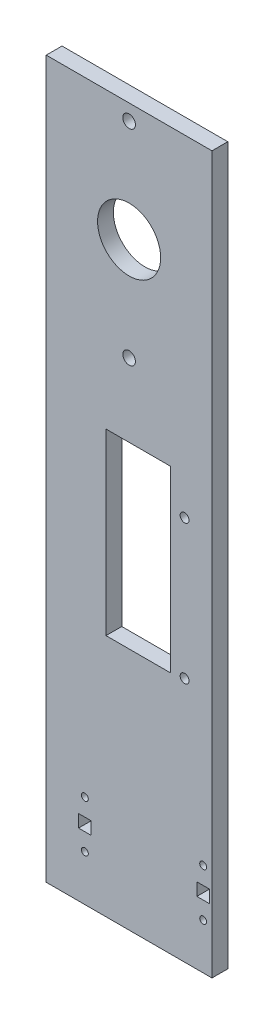
ISO-10303-21;
HEADER;
FILE_DESCRIPTION(('STEP AP214'),'2;1');
FILE_NAME('part.step','',(''),(''),'','','');
FILE_SCHEMA(('AUTOMOTIVE_DESIGN { 1 0 10303 214 1 1 1 1 }'));
ENDSEC;
DATA;
#1=APPLICATION_CONTEXT('core data for automotive mechanical design processes');
#2=APPLICATION_PROTOCOL_DEFINITION('international standard','automotive_design',2000,#1);
#3=PRODUCT_CONTEXT('',#1,'mechanical');
#4=PRODUCT('Part','Part','',(#3));
#5=PRODUCT_RELATED_PRODUCT_CATEGORY('part','',(#4));
#6=PRODUCT_DEFINITION_FORMATION('','',#4);
#7=PRODUCT_DEFINITION_CONTEXT('part definition',#1,'design');
#8=PRODUCT_DEFINITION('design','',#6,#7);
#9=PRODUCT_DEFINITION_SHAPE('','',#8);
#10=(LENGTH_UNIT() NAMED_UNIT(*) SI_UNIT(.MILLI.,.METRE.));
#11=(NAMED_UNIT(*) PLANE_ANGLE_UNIT() SI_UNIT($,.RADIAN.));
#12=(NAMED_UNIT(*) SI_UNIT($,.STERADIAN.) SOLID_ANGLE_UNIT());
#13=UNCERTAINTY_MEASURE_WITH_UNIT(LENGTH_MEASURE(1.E-05),#10,'distance_accuracy_value','');
#14=(GEOMETRIC_REPRESENTATION_CONTEXT(3) GLOBAL_UNCERTAINTY_ASSIGNED_CONTEXT((#13)) GLOBAL_UNIT_ASSIGNED_CONTEXT((#10,
#11,#12)) REPRESENTATION_CONTEXT('',''));
#15=CARTESIAN_POINT('',(0.,0.,0.));
#16=DIRECTION('',(0.,0.,1.));
#17=DIRECTION('',(1.,0.,0.));
#18=AXIS2_PLACEMENT_3D('',#15,#16,#17);
#19=CARTESIAN_POINT('',(0.,0.,6.35));
#20=DIRECTION('',(0.,0.,1.));
#21=DIRECTION('',(1.,0.,0.));
#22=AXIS2_PLACEMENT_3D('',#19,#20,#21);
#23=PLANE('',#22);
#24=DIRECTION('',(0.,-1.,0.));
#25=VECTOR('',#24,1.);
#26=CARTESIAN_POINT('',(24.05,-118.29,6.35));
#27=LINE('',#26,#25);
#28=CARTESIAN_POINT('',(24.05,-118.29,6.35));
#29=VERTEX_POINT('',#28);
#30=CARTESIAN_POINT('',(24.05,-190.29,6.35));
#31=VERTEX_POINT('',#30);
#32=EDGE_CURVE('E162',#29,#31,#27,.T.);
#33=ORIENTED_EDGE('',*,*,#32,.F.);
#34=DIRECTION('',(-1.,0.,0.));
#35=VECTOR('',#34,1.);
#36=CARTESIAN_POINT('',(50.05,-118.29,6.35));
#37=LINE('',#36,#35);
#38=CARTESIAN_POINT('',(50.05,-118.29,6.35));
#39=VERTEX_POINT('',#38);
#40=EDGE_CURVE('E153',#39,#29,#37,.T.);
#41=ORIENTED_EDGE('',*,*,#40,.F.);
#42=DIRECTION('',(0.,1.,0.));
#43=VECTOR('',#42,1.);
#44=CARTESIAN_POINT('',(50.05,-190.29,6.35));
#45=LINE('',#44,#43);
#46=CARTESIAN_POINT('',(50.05,-190.29,6.35));
#47=VERTEX_POINT('',#46);
#48=EDGE_CURVE('E180',#47,#39,#45,.T.);
#49=ORIENTED_EDGE('',*,*,#48,.F.);
#50=DIRECTION('',(1.,0.,0.));
#51=VECTOR('',#50,1.);
#52=CARTESIAN_POINT('',(24.05,-190.29,6.35));
#53=LINE('',#52,#51);
#54=EDGE_CURVE('E176',#31,#47,#53,.T.);
#55=ORIENTED_EDGE('',*,*,#54,.F.);
#56=EDGE_LOOP('',(#33,#41,#49,#55));
#57=FACE_BOUND('',#56,.T.);
#58=CARTESIAN_POINT('',(33.35,-47.6,6.35));
#59=DIRECTION('',(0.,0.,1.));
#60=DIRECTION('',(1.,0.,0.));
#61=AXIS2_PLACEMENT_3D('',#58,#59,#60);
#62=CIRCLE('',#61,12.7);
#63=CARTESIAN_POINT('',(46.05,-47.6,6.35));
#64=VERTEX_POINT('',#63);
#65=EDGE_CURVE('E204',#64,#64,#62,.T.);
#66=ORIENTED_EDGE('',*,*,#65,.F.);
#67=EDGE_LOOP('',(#66));
#68=FACE_BOUND('',#67,.T.);
#69=CARTESIAN_POINT('',(55.675,-189.39,6.35));
#70=DIRECTION('',(0.,0.,1.));
#71=DIRECTION('',(1.,0.,0.));
#72=AXIS2_PLACEMENT_3D('',#69,#70,#71);
#73=CIRCLE('',#72,1.7859375);
#74=CARTESIAN_POINT('',(57.4609375,-189.39,6.35));
#75=VERTEX_POINT('',#74);
#76=EDGE_CURVE('E220',#75,#75,#73,.T.);
#77=ORIENTED_EDGE('',*,*,#76,.F.);
#78=EDGE_LOOP('',(#77));
#79=FACE_BOUND('',#78,.T.);
#80=DIRECTION('',(0.,1.,0.));
#81=VECTOR('',#80,1.);
#82=CARTESIAN_POINT('',(18.08,-262.89,6.35));
#83=LINE('',#82,#81);
#84=CARTESIAN_POINT('',(18.08,-262.89,6.35));
#85=VERTEX_POINT('',#84);
#86=CARTESIAN_POINT('',(18.08,-257.81,6.35));
#87=VERTEX_POINT('',#86);
#88=EDGE_CURVE('E239',#85,#87,#83,.T.);
#89=ORIENTED_EDGE('',*,*,#88,.F.);
#90=DIRECTION('',(1.,0.,0.));
#91=VECTOR('',#90,1.);
#92=CARTESIAN_POINT('',(13.,-262.89,6.35));
#93=LINE('',#92,#91);
#94=CARTESIAN_POINT('',(13.,-262.89,6.35));
#95=VERTEX_POINT('',#94);
#96=EDGE_CURVE('E236',#95,#85,#93,.T.);
#97=ORIENTED_EDGE('',*,*,#96,.F.);
#98=DIRECTION('',(0.,-1.,0.));
#99=VECTOR('',#98,1.);
#100=CARTESIAN_POINT('',(13.,-262.89,6.35));
#101=LINE('',#100,#99);
#102=CARTESIAN_POINT('',(13.,-257.81,6.35));
#103=VERTEX_POINT('',#102);
#104=EDGE_CURVE('E247',#103,#95,#101,.T.);
#105=ORIENTED_EDGE('',*,*,#104,.F.);
#106=DIRECTION('',(-1.,0.,0.));
#107=VECTOR('',#106,1.);
#108=CARTESIAN_POINT('',(13.,-257.81,6.35));
#109=LINE('',#108,#107);
#110=EDGE_CURVE('E243',#87,#103,#109,.T.);
#111=ORIENTED_EDGE('',*,*,#110,.F.);
#112=EDGE_LOOP('',(#89,#97,#105,#111));
#113=FACE_BOUND('',#112,.T.);
#114=CARTESIAN_POINT('',(15.54,-269.875,6.35));
#115=DIRECTION('',(0.,0.,1.));
#116=DIRECTION('',(1.,0.,0.));
#117=AXIS2_PLACEMENT_3D('',#114,#115,#116);
#118=CIRCLE('',#117,1.38906249999998);
#119=CARTESIAN_POINT('',(16.9290625,-269.875,6.35));
#120=VERTEX_POINT('',#119);
#121=EDGE_CURVE('E279',#120,#120,#118,.T.);
#122=ORIENTED_EDGE('',*,*,#121,.F.);
#123=EDGE_LOOP('',(#122));
#124=FACE_BOUND('',#123,.T.);
#125=CARTESIAN_POINT('',(63.16,-250.825,6.35));
#126=DIRECTION('',(0.,0.,1.));
#127=DIRECTION('',(1.,0.,0.));
#128=AXIS2_PLACEMENT_3D('',#125,#126,#127);
#129=CIRCLE('',#128,1.38906249999997);
#130=CARTESIAN_POINT('',(64.5490625,-250.825,6.35));
#131=VERTEX_POINT('',#130);
#132=EDGE_CURVE('E295',#131,#131,#129,.T.);
#133=ORIENTED_EDGE('',*,*,#132,.F.);
#134=EDGE_LOOP('',(#133));
#135=FACE_BOUND('',#134,.T.);
#136=DIRECTION('',(1.,0.,0.));
#137=VECTOR('',#136,1.);
#138=CARTESIAN_POINT('',(60.62,-262.89,6.35));
#139=LINE('',#138,#137);
#140=CARTESIAN_POINT('',(60.62,-262.89,6.35));
#141=VERTEX_POINT('',#140);
#142=CARTESIAN_POINT('',(65.7,-262.89,6.35));
#143=VERTEX_POINT('',#142);
#144=EDGE_CURVE('E314',#141,#143,#139,.T.);
#145=ORIENTED_EDGE('',*,*,#144,.F.);
#146=DIRECTION('',(0.,-1.,0.));
#147=VECTOR('',#146,1.);
#148=CARTESIAN_POINT('',(60.62,-257.81,6.35));
#149=LINE('',#148,#147);
#150=CARTESIAN_POINT('',(60.62,-257.81,6.35));
#151=VERTEX_POINT('',#150);
#152=EDGE_CURVE('E311',#151,#141,#149,.T.);
#153=ORIENTED_EDGE('',*,*,#152,.F.);
#154=DIRECTION('',(-1.,0.,0.));
#155=VECTOR('',#154,1.);
#156=CARTESIAN_POINT('',(60.62,-257.81,6.35));
#157=LINE('',#156,#155);
#158=CARTESIAN_POINT('',(65.7,-257.81,6.35));
#159=VERTEX_POINT('',#158);
#160=EDGE_CURVE('E322',#159,#151,#157,.T.);
#161=ORIENTED_EDGE('',*,*,#160,.F.);
#162=DIRECTION('',(0.,1.,0.));
#163=VECTOR('',#162,1.);
#164=CARTESIAN_POINT('',(65.7,-257.81,6.35));
#165=LINE('',#164,#163);
#166=EDGE_CURVE('E318',#143,#159,#165,.T.);
#167=ORIENTED_EDGE('',*,*,#166,.F.);
#168=EDGE_LOOP('',(#145,#153,#161,#167));
#169=FACE_BOUND('',#168,.T.);
#170=DIRECTION('',(0.,1.,0.));
#171=VECTOR('',#170,1.);
#172=CARTESIAN_POINT('',(66.7,-288.29,6.35));
#173=LINE('',#172,#171);
#174=CARTESIAN_POINT('',(66.7,-288.29,6.35));
#175=VERTEX_POINT('',#174);
#176=CARTESIAN_POINT('',(66.7,0.,6.35));
#177=VERTEX_POINT('',#176);
#178=EDGE_CURVE('E354',#175,#177,#173,.T.);
#179=ORIENTED_EDGE('',*,*,#178,.T.);
#180=DIRECTION('',(-1.,0.,0.));
#181=VECTOR('',#180,1.);
#182=CARTESIAN_POINT('',(66.7,0.,6.35));
#183=LINE('',#182,#181);
#184=CARTESIAN_POINT('',(0.,0.,6.35));
#185=VERTEX_POINT('',#184);
#186=EDGE_CURVE('E358',#177,#185,#183,.T.);
#187=ORIENTED_EDGE('',*,*,#186,.T.);
#188=DIRECTION('',(0.,-1.,0.));
#189=VECTOR('',#188,1.);
#190=CARTESIAN_POINT('',(0.,0.,6.35));
#191=LINE('',#190,#189);
#192=CARTESIAN_POINT('',(0.,-288.29,6.35));
#193=VERTEX_POINT('',#192);
#194=EDGE_CURVE('E362',#185,#193,#191,.T.);
#195=ORIENTED_EDGE('',*,*,#194,.T.);
#196=DIRECTION('',(1.,0.,0.));
#197=VECTOR('',#196,1.);
#198=CARTESIAN_POINT('',(0.,-288.29,6.35));
#199=LINE('',#198,#197);
#200=EDGE_CURVE('E365',#193,#175,#199,.T.);
#201=ORIENTED_EDGE('',*,*,#200,.T.);
#202=EDGE_LOOP('',(#179,#187,#195,#201));
#203=FACE_BOUND('',#202,.T.);
#204=CARTESIAN_POINT('',(63.16,-269.875,6.35));
#205=DIRECTION('',(0.,0.,1.));
#206=DIRECTION('',(1.,0.,0.));
#207=AXIS2_PLACEMENT_3D('',#204,#205,#206);
#208=CIRCLE('',#207,1.38906249999997);
#209=CARTESIAN_POINT('',(64.5490625,-269.875,6.35));
#210=VERTEX_POINT('',#209);
#211=EDGE_CURVE('E303',#210,#210,#208,.T.);
#212=ORIENTED_EDGE('',*,*,#211,.F.);
#213=EDGE_LOOP('',(#212));
#214=FACE_BOUND('',#213,.T.);
#215=CARTESIAN_POINT('',(15.54,-250.825,6.35));
#216=DIRECTION('',(0.,0.,1.));
#217=DIRECTION('',(1.,0.,0.));
#218=AXIS2_PLACEMENT_3D('',#215,#216,#217);
#219=CIRCLE('',#218,1.38906249999998);
#220=CARTESIAN_POINT('',(16.9290625,-250.825,6.35));
#221=VERTEX_POINT('',#220);
#222=EDGE_CURVE('E287',#221,#221,#219,.T.);
#223=ORIENTED_EDGE('',*,*,#222,.F.);
#224=EDGE_LOOP('',(#223));
#225=FACE_BOUND('',#224,.T.);
#226=CARTESIAN_POINT('',(55.675,-133.39,6.35));
#227=DIRECTION('',(0.,0.,1.));
#228=DIRECTION('',(1.,0.,0.));
#229=AXIS2_PLACEMENT_3D('',#226,#227,#228);
#230=CIRCLE('',#229,1.78593749999999);
#231=CARTESIAN_POINT('',(57.4609375,-133.39,6.35));
#232=VERTEX_POINT('',#231);
#233=EDGE_CURVE('E228',#232,#232,#230,.T.);
#234=ORIENTED_EDGE('',*,*,#233,.F.);
#235=EDGE_LOOP('',(#234));
#236=FACE_BOUND('',#235,.T.);
#237=CARTESIAN_POINT('',(33.35,-88.85,6.35));
#238=DIRECTION('',(0.,0.,1.));
#239=DIRECTION('',(1.,0.,0.));
#240=AXIS2_PLACEMENT_3D('',#237,#238,#239);
#241=CIRCLE('',#240,2.54);
#242=CARTESIAN_POINT('',(35.89,-88.85,6.35));
#243=VERTEX_POINT('',#242);
#244=EDGE_CURVE('E212',#243,#243,#241,.T.);
#245=ORIENTED_EDGE('',*,*,#244,.F.);
#246=EDGE_LOOP('',(#245));
#247=FACE_BOUND('',#246,.T.);
#248=CARTESIAN_POINT('',(33.35,-6.34999999999999,6.35));
#249=DIRECTION('',(0.,0.,1.));
#250=DIRECTION('',(1.,0.,0.));
#251=AXIS2_PLACEMENT_3D('',#248,#249,#250);
#252=CIRCLE('',#251,2.54);
#253=CARTESIAN_POINT('',(35.89,-6.34999999999999,6.35));
#254=VERTEX_POINT('',#253);
#255=EDGE_CURVE('E188',#254,#254,#252,.T.);
#256=ORIENTED_EDGE('',*,*,#255,.F.);
#257=EDGE_LOOP('',(#256));
#258=FACE_BOUND('',#257,.T.);
#259=ADVANCED_FACE('F39',(#57,#68,#79,#113,#124,#135,#169,#203,#214,#225,#236,#247,#258),#23,.T.);
#260=CARTESIAN_POINT('',(0.,0.,0.));
#261=DIRECTION('',(0.,0.,1.));
#262=DIRECTION('',(1.,0.,0.));
#263=AXIS2_PLACEMENT_3D('',#260,#261,#262);
#264=PLANE('',#263);
#265=CARTESIAN_POINT('',(33.35,-47.6,0.));
#266=DIRECTION('',(0.,0.,1.));
#267=DIRECTION('',(1.,0.,0.));
#268=AXIS2_PLACEMENT_3D('',#265,#266,#267);
#269=CIRCLE('',#268,12.7);
#270=CARTESIAN_POINT('',(46.05,-47.6,0.));
#271=VERTEX_POINT('',#270);
#272=EDGE_CURVE('E171',#271,#271,#269,.T.);
#273=ORIENTED_EDGE('',*,*,#272,.T.);
#274=EDGE_LOOP('',(#273));
#275=FACE_BOUND('',#274,.T.);
#276=CARTESIAN_POINT('',(33.35,-88.85,0.));
#277=DIRECTION('',(0.,0.,1.));
#278=DIRECTION('',(1.,0.,0.));
#279=AXIS2_PLACEMENT_3D('',#276,#277,#278);
#280=CIRCLE('',#279,2.54);
#281=CARTESIAN_POINT('',(35.89,-88.85,0.));
#282=VERTEX_POINT('',#281);
#283=EDGE_CURVE('E208',#282,#282,#280,.T.);
#284=ORIENTED_EDGE('',*,*,#283,.T.);
#285=EDGE_LOOP('',(#284));
#286=FACE_BOUND('',#285,.T.);
#287=CARTESIAN_POINT('',(55.675,-189.39,0.));
#288=DIRECTION('',(0.,0.,1.));
#289=DIRECTION('',(1.,0.,0.));
#290=AXIS2_PLACEMENT_3D('',#287,#288,#289);
#291=CIRCLE('',#290,1.7859375);
#292=CARTESIAN_POINT('',(57.4609375,-189.39,0.));
#293=VERTEX_POINT('',#292);
#294=EDGE_CURVE('E216',#293,#293,#291,.T.);
#295=ORIENTED_EDGE('',*,*,#294,.T.);
#296=EDGE_LOOP('',(#295));
#297=FACE_BOUND('',#296,.T.);
#298=CARTESIAN_POINT('',(55.675,-133.39,0.));
#299=DIRECTION('',(0.,0.,1.));
#300=DIRECTION('',(1.,0.,0.));
#301=AXIS2_PLACEMENT_3D('',#298,#299,#300);
#302=CIRCLE('',#301,1.78593749999999);
#303=CARTESIAN_POINT('',(57.4609375,-133.39,0.));
#304=VERTEX_POINT('',#303);
#305=EDGE_CURVE('E224',#304,#304,#302,.T.);
#306=ORIENTED_EDGE('',*,*,#305,.T.);
#307=EDGE_LOOP('',(#306));
#308=FACE_BOUND('',#307,.T.);
#309=DIRECTION('',(1.,0.,0.));
#310=VECTOR('',#309,1.);
#311=CARTESIAN_POINT('',(13.,-262.89,0.));
#312=LINE('',#311,#310);
#313=CARTESIAN_POINT('',(13.,-262.89,0.));
#314=VERTEX_POINT('',#313);
#315=CARTESIAN_POINT('',(18.08,-262.89,0.));
#316=VERTEX_POINT('',#315);
#317=EDGE_CURVE('E232',#314,#316,#312,.T.);
#318=ORIENTED_EDGE('',*,*,#317,.T.);
#319=DIRECTION('',(0.,1.,0.));
#320=VECTOR('',#319,1.);
#321=CARTESIAN_POINT('',(18.08,-262.89,0.));
#322=LINE('',#321,#320);
#323=CARTESIAN_POINT('',(18.08,-257.81,0.));
#324=VERTEX_POINT('',#323);
#325=EDGE_CURVE('E254',#316,#324,#322,.T.);
#326=ORIENTED_EDGE('',*,*,#325,.T.);
#327=DIRECTION('',(-1.,0.,0.));
#328=VECTOR('',#327,1.);
#329=CARTESIAN_POINT('',(13.,-257.81,0.));
#330=LINE('',#329,#328);
#331=CARTESIAN_POINT('',(13.,-257.81,0.));
#332=VERTEX_POINT('',#331);
#333=EDGE_CURVE('E258',#324,#332,#330,.T.);
#334=ORIENTED_EDGE('',*,*,#333,.T.);
#335=DIRECTION('',(0.,-1.,0.));
#336=VECTOR('',#335,1.);
#337=CARTESIAN_POINT('',(13.,-262.89,0.));
#338=LINE('',#337,#336);
#339=EDGE_CURVE('E240',#332,#314,#338,.T.);
#340=ORIENTED_EDGE('',*,*,#339,.T.);
#341=EDGE_LOOP('',(#318,#326,#334,#340));
#342=FACE_BOUND('',#341,.T.);
#343=DIRECTION('',(0.,1.,0.));
#344=VECTOR('',#343,1.);
#345=CARTESIAN_POINT('',(66.7,-288.29,0.));
#346=LINE('',#345,#344);
#347=CARTESIAN_POINT('',(66.7,-288.29,0.));
#348=VERTEX_POINT('',#347);
#349=CARTESIAN_POINT('',(66.7,0.,0.));
#350=VERTEX_POINT('',#349);
#351=EDGE_CURVE('E353',#348,#350,#346,.T.);
#352=ORIENTED_EDGE('',*,*,#351,.F.);
#353=DIRECTION('',(1.,0.,0.));
#354=VECTOR('',#353,1.);
#355=CARTESIAN_POINT('',(0.,-288.29,0.));
#356=LINE('',#355,#354);
#357=CARTESIAN_POINT('',(0.,-288.29,0.));
#358=VERTEX_POINT('',#357);
#359=EDGE_CURVE('E359',#358,#348,#356,.T.);
#360=ORIENTED_EDGE('',*,*,#359,.F.);
#361=DIRECTION('',(0.,-1.,0.));
#362=VECTOR('',#361,1.);
#363=CARTESIAN_POINT('',(0.,0.,0.));
#364=LINE('',#363,#362);
#365=CARTESIAN_POINT('',(0.,0.,0.));
#366=VERTEX_POINT('',#365);
#367=EDGE_CURVE('E375',#366,#358,#364,.T.);
#368=ORIENTED_EDGE('',*,*,#367,.F.);
#369=DIRECTION('',(-1.,0.,0.));
#370=VECTOR('',#369,1.);
#371=CARTESIAN_POINT('',(66.7,0.,0.));
#372=LINE('',#371,#370);
#373=EDGE_CURVE('E372',#350,#366,#372,.T.);
#374=ORIENTED_EDGE('',*,*,#373,.F.);
#375=EDGE_LOOP('',(#352,#360,#368,#374));
#376=FACE_BOUND('',#375,.T.);
#377=DIRECTION('',(0.,-1.,0.));
#378=VECTOR('',#377,1.);
#379=CARTESIAN_POINT('',(60.62,-257.81,0.));
#380=LINE('',#379,#378);
#381=CARTESIAN_POINT('',(60.62,-257.81,0.));
#382=VERTEX_POINT('',#381);
#383=CARTESIAN_POINT('',(60.62,-262.89,0.));
#384=VERTEX_POINT('',#383);
#385=EDGE_CURVE('E307',#382,#384,#380,.T.);
#386=ORIENTED_EDGE('',*,*,#385,.T.);
#387=DIRECTION('',(1.,0.,0.));
#388=VECTOR('',#387,1.);
#389=CARTESIAN_POINT('',(60.62,-262.89,0.));
#390=LINE('',#389,#388);
#391=CARTESIAN_POINT('',(65.7,-262.89,0.));
#392=VERTEX_POINT('',#391);
#393=EDGE_CURVE('E329',#384,#392,#390,.T.);
#394=ORIENTED_EDGE('',*,*,#393,.T.);
#395=DIRECTION('',(0.,1.,0.));
#396=VECTOR('',#395,1.);
#397=CARTESIAN_POINT('',(65.7,-257.81,0.));
#398=LINE('',#397,#396);
#399=CARTESIAN_POINT('',(65.7,-257.81,0.));
#400=VERTEX_POINT('',#399);
#401=EDGE_CURVE('E333',#392,#400,#398,.T.);
#402=ORIENTED_EDGE('',*,*,#401,.T.);
#403=DIRECTION('',(-1.,0.,0.));
#404=VECTOR('',#403,1.);
#405=CARTESIAN_POINT('',(60.62,-257.81,0.));
#406=LINE('',#405,#404);
#407=EDGE_CURVE('E315',#400,#382,#406,.T.);
#408=ORIENTED_EDGE('',*,*,#407,.T.);
#409=EDGE_LOOP('',(#386,#394,#402,#408));
#410=FACE_BOUND('',#409,.T.);
#411=CARTESIAN_POINT('',(63.16,-269.875,0.));
#412=DIRECTION('',(0.,0.,1.));
#413=DIRECTION('',(1.,0.,0.));
#414=AXIS2_PLACEMENT_3D('',#411,#412,#413);
#415=CIRCLE('',#414,1.38906249999997);
#416=CARTESIAN_POINT('',(64.5490625,-269.875,0.));
#417=VERTEX_POINT('',#416);
#418=EDGE_CURVE('E299',#417,#417,#415,.T.);
#419=ORIENTED_EDGE('',*,*,#418,.T.);
#420=EDGE_LOOP('',(#419));
#421=FACE_BOUND('',#420,.T.);
#422=CARTESIAN_POINT('',(63.16,-250.825,0.));
#423=DIRECTION('',(0.,0.,1.));
#424=DIRECTION('',(1.,0.,0.));
#425=AXIS2_PLACEMENT_3D('',#422,#423,#424);
#426=CIRCLE('',#425,1.38906249999997);
#427=CARTESIAN_POINT('',(64.5490625,-250.825,0.));
#428=VERTEX_POINT('',#427);
#429=EDGE_CURVE('E291',#428,#428,#426,.T.);
#430=ORIENTED_EDGE('',*,*,#429,.T.);
#431=EDGE_LOOP('',(#430));
#432=FACE_BOUND('',#431,.T.);
#433=CARTESIAN_POINT('',(15.54,-250.825,0.));
#434=DIRECTION('',(0.,0.,1.));
#435=DIRECTION('',(1.,0.,0.));
#436=AXIS2_PLACEMENT_3D('',#433,#434,#435);
#437=CIRCLE('',#436,1.38906249999998);
#438=CARTESIAN_POINT('',(16.9290625,-250.825,0.));
#439=VERTEX_POINT('',#438);
#440=EDGE_CURVE('E283',#439,#439,#437,.T.);
#441=ORIENTED_EDGE('',*,*,#440,.T.);
#442=EDGE_LOOP('',(#441));
#443=FACE_BOUND('',#442,.T.);
#444=CARTESIAN_POINT('',(15.54,-269.875,0.));
#445=DIRECTION('',(0.,0.,1.));
#446=DIRECTION('',(1.,0.,0.));
#447=AXIS2_PLACEMENT_3D('',#444,#445,#446);
#448=CIRCLE('',#447,1.38906249999998);
#449=CARTESIAN_POINT('',(16.9290625,-269.875,0.));
#450=VERTEX_POINT('',#449);
#451=EDGE_CURVE('E278',#450,#450,#448,.T.);
#452=ORIENTED_EDGE('',*,*,#451,.T.);
#453=EDGE_LOOP('',(#452));
#454=FACE_BOUND('',#453,.T.);
#455=DIRECTION('',(-1.,0.,0.));
#456=VECTOR('',#455,1.);
#457=CARTESIAN_POINT('',(50.05,-118.29,0.));
#458=LINE('',#457,#456);
#459=CARTESIAN_POINT('',(50.05,-118.29,0.));
#460=VERTEX_POINT('',#459);
#461=CARTESIAN_POINT('',(24.05,-118.29,0.));
#462=VERTEX_POINT('',#461);
#463=EDGE_CURVE('E63',#460,#462,#458,.T.);
#464=ORIENTED_EDGE('',*,*,#463,.T.);
#465=DIRECTION('',(0.,-1.,0.));
#466=VECTOR('',#465,1.);
#467=CARTESIAN_POINT('',(24.05,-118.29,0.));
#468=LINE('',#467,#466);
#469=CARTESIAN_POINT('',(24.05,-190.29,0.));
#470=VERTEX_POINT('',#469);
#471=EDGE_CURVE('E169',#462,#470,#468,.T.);
#472=ORIENTED_EDGE('',*,*,#471,.T.);
#473=DIRECTION('',(1.,0.,0.));
#474=VECTOR('',#473,1.);
#475=CARTESIAN_POINT('',(24.05,-190.29,0.));
#476=LINE('',#475,#474);
#477=CARTESIAN_POINT('',(50.05,-190.29,0.));
#478=VERTEX_POINT('',#477);
#479=EDGE_CURVE('E191',#470,#478,#476,.T.);
#480=ORIENTED_EDGE('',*,*,#479,.T.);
#481=DIRECTION('',(0.,1.,0.));
#482=VECTOR('',#481,1.);
#483=CARTESIAN_POINT('',(50.05,-190.29,0.));
#484=LINE('',#483,#482);
#485=EDGE_CURVE('E163',#478,#460,#484,.T.);
#486=ORIENTED_EDGE('',*,*,#485,.T.);
#487=EDGE_LOOP('',(#464,#472,#480,#486));
#488=FACE_BOUND('',#487,.T.);
#489=CARTESIAN_POINT('',(33.35,-6.34999999999999,0.));
#490=DIRECTION('',(0.,0.,1.));
#491=DIRECTION('',(1.,0.,0.));
#492=AXIS2_PLACEMENT_3D('',#489,#490,#491);
#493=CIRCLE('',#492,2.54);
#494=CARTESIAN_POINT('',(35.89,-6.34999999999999,0.));
#495=VERTEX_POINT('',#494);
#496=EDGE_CURVE('E528',#495,#495,#493,.T.);
#497=ORIENTED_EDGE('',*,*,#496,.T.);
#498=EDGE_LOOP('',(#497));
#499=FACE_BOUND('',#498,.T.);
#500=ADVANCED_FACE('F398',(#275,#286,#297,#308,#342,#376,#410,#421,#432,#443,#454,#488,#499),
#264,.F.);
#501=CARTESIAN_POINT('',(66.7,-288.29,6.35));
#502=DIRECTION('',(-1.,0.,0.));
#503=DIRECTION('',(0.,0.,1.));
#504=AXIS2_PLACEMENT_3D('',#501,#502,#503);
#505=PLANE('',#504);
#506=ORIENTED_EDGE('',*,*,#351,.T.);
#507=DIRECTION('',(0.,0.,-1.));
#508=VECTOR('',#507,1.);
#509=CARTESIAN_POINT('',(66.7,0.,6.35));
#510=LINE('',#509,#508);
#511=EDGE_CURVE('E11',#177,#350,#510,.T.);
#512=ORIENTED_EDGE('',*,*,#511,.F.);
#513=ORIENTED_EDGE('',*,*,#178,.F.);
#514=DIRECTION('',(0.,0.,-1.));
#515=VECTOR('',#514,1.);
#516=CARTESIAN_POINT('',(66.7,-288.29,6.35));
#517=LINE('',#516,#515);
#518=EDGE_CURVE('E368',#175,#348,#517,.T.);
#519=ORIENTED_EDGE('',*,*,#518,.T.);
#520=EDGE_LOOP('',(#506,#512,#513,#519));
#521=FACE_BOUND('',#520,.T.);
#522=ADVANCED_FACE('F41',(#521),#505,.F.);
#523=CARTESIAN_POINT('',(66.7,0.,6.35));
#524=DIRECTION('',(0.,-1.,0.));
#525=DIRECTION('',(1.,0.,0.));
#526=AXIS2_PLACEMENT_3D('',#523,#524,#525);
#527=PLANE('',#526);
#528=ORIENTED_EDGE('',*,*,#373,.T.);
#529=DIRECTION('',(0.,0.,-1.));
#530=VECTOR('',#529,1.);
#531=CARTESIAN_POINT('',(0.,0.,6.35));
#532=LINE('',#531,#530);
#533=EDGE_CURVE('E48',#185,#366,#532,.T.);
#534=ORIENTED_EDGE('',*,*,#533,.F.);
#535=ORIENTED_EDGE('',*,*,#186,.F.);
#536=ORIENTED_EDGE('',*,*,#511,.T.);
#537=EDGE_LOOP('',(#528,#534,#535,#536));
#538=FACE_BOUND('',#537,.T.);
#539=ADVANCED_FACE('F409',(#538),#527,.F.);
#540=CARTESIAN_POINT('',(0.,0.,6.35));
#541=DIRECTION('',(1.,0.,0.));
#542=DIRECTION('',(0.,0.,-1.));
#543=AXIS2_PLACEMENT_3D('',#540,#541,#542);
#544=PLANE('',#543);
#545=ORIENTED_EDGE('',*,*,#367,.T.);
#546=DIRECTION('',(0.,0.,-1.));
#547=VECTOR('',#546,1.);
#548=CARTESIAN_POINT('',(0.,-288.29,6.35));
#549=LINE('',#548,#547);
#550=EDGE_CURVE('E383',#193,#358,#549,.T.);
#551=ORIENTED_EDGE('',*,*,#550,.F.);
#552=ORIENTED_EDGE('',*,*,#194,.F.);
#553=ORIENTED_EDGE('',*,*,#533,.T.);
#554=EDGE_LOOP('',(#545,#551,#552,#553));
#555=FACE_BOUND('',#554,.T.);
#556=ADVANCED_FACE('F392',(#555),#544,.F.);
#557=CARTESIAN_POINT('',(0.,-288.29,6.35));
#558=DIRECTION('',(0.,1.,0.));
#559=DIRECTION('',(0.,0.,1.));
#560=AXIS2_PLACEMENT_3D('',#557,#558,#559);
#561=PLANE('',#560);
#562=ORIENTED_EDGE('',*,*,#359,.T.);
#563=ORIENTED_EDGE('',*,*,#518,.F.);
#564=ORIENTED_EDGE('',*,*,#200,.F.);
#565=ORIENTED_EDGE('',*,*,#550,.T.);
#566=EDGE_LOOP('',(#562,#563,#564,#565));
#567=FACE_BOUND('',#566,.T.);
#568=ADVANCED_FACE('F402',(#567),#561,.F.);
#569=CARTESIAN_POINT('',(60.62,-257.81,6.35));
#570=DIRECTION('',(1.,0.,0.));
#571=DIRECTION('',(0.,0.,-1.));
#572=AXIS2_PLACEMENT_3D('',#569,#570,#571);
#573=PLANE('',#572);
#574=ORIENTED_EDGE('',*,*,#385,.F.);
#575=DIRECTION('',(0.,0.,-1.));
#576=VECTOR('',#575,1.);
#577=CARTESIAN_POINT('',(60.62,-257.81,6.35));
#578=LINE('',#577,#576);
#579=EDGE_CURVE('E325',#151,#382,#578,.T.);
#580=ORIENTED_EDGE('',*,*,#579,.F.);
#581=ORIENTED_EDGE('',*,*,#152,.T.);
#582=DIRECTION('',(0.,0.,-1.));
#583=VECTOR('',#582,1.);
#584=CARTESIAN_POINT('',(60.62,-262.89,6.35));
#585=LINE('',#584,#583);
#586=EDGE_CURVE('E349',#141,#384,#585,.T.);
#587=ORIENTED_EDGE('',*,*,#586,.T.);
#588=EDGE_LOOP('',(#574,#580,#581,#587));
#589=FACE_BOUND('',#588,.T.);
#590=ADVANCED_FACE('F424',(#589),#573,.T.);
#591=CARTESIAN_POINT('',(60.62,-262.89,6.35));
#592=DIRECTION('',(0.,1.,0.));
#593=DIRECTION('',(0.,0.,1.));
#594=AXIS2_PLACEMENT_3D('',#591,#592,#593);
#595=PLANE('',#594);
#596=ORIENTED_EDGE('',*,*,#393,.F.);
#597=ORIENTED_EDGE('',*,*,#586,.F.);
#598=ORIENTED_EDGE('',*,*,#144,.T.);
#599=DIRECTION('',(0.,0.,-1.));
#600=VECTOR('',#599,1.);
#601=CARTESIAN_POINT('',(65.7,-262.89,6.35));
#602=LINE('',#601,#600);
#603=EDGE_CURVE('E346',#143,#392,#602,.T.);
#604=ORIENTED_EDGE('',*,*,#603,.T.);
#605=EDGE_LOOP('',(#596,#597,#598,#604));
#606=FACE_BOUND('',#605,.T.);
#607=ADVANCED_FACE('F431',(#606),#595,.T.);
#608=CARTESIAN_POINT('',(65.7,-257.81,6.35));
#609=DIRECTION('',(-1.,0.,0.));
#610=DIRECTION('',(0.,0.,1.));
#611=AXIS2_PLACEMENT_3D('',#608,#609,#610);
#612=PLANE('',#611);
#613=ORIENTED_EDGE('',*,*,#401,.F.);
#614=ORIENTED_EDGE('',*,*,#603,.F.);
#615=ORIENTED_EDGE('',*,*,#166,.T.);
#616=DIRECTION('',(0.,0.,-1.));
#617=VECTOR('',#616,1.);
#618=CARTESIAN_POINT('',(65.7,-257.81,6.35));
#619=LINE('',#618,#617);
#620=EDGE_CURVE('E343',#159,#400,#619,.T.);
#621=ORIENTED_EDGE('',*,*,#620,.T.);
#622=EDGE_LOOP('',(#613,#614,#615,#621));
#623=FACE_BOUND('',#622,.T.);
#624=ADVANCED_FACE('F436',(#623),#612,.T.);
#625=CARTESIAN_POINT('',(60.62,-257.81,6.35));
#626=DIRECTION('',(0.,-1.,0.));
#627=DIRECTION('',(0.,0.,-1.));
#628=AXIS2_PLACEMENT_3D('',#625,#626,#627);
#629=PLANE('',#628);
#630=ORIENTED_EDGE('',*,*,#407,.F.);
#631=ORIENTED_EDGE('',*,*,#620,.F.);
#632=ORIENTED_EDGE('',*,*,#160,.T.);
#633=ORIENTED_EDGE('',*,*,#579,.T.);
#634=EDGE_LOOP('',(#630,#631,#632,#633));
#635=FACE_BOUND('',#634,.T.);
#636=ADVANCED_FACE('F443',(#635),#629,.T.);
#637=CARTESIAN_POINT('',(63.16,-269.875,6.35));
#638=DIRECTION('',(0.,0.,-1.));
#639=DIRECTION('',(-1.,0.,0.));
#640=AXIS2_PLACEMENT_3D('',#637,#638,#639);
#641=CYLINDRICAL_SURFACE('',#640,1.38906249999997);
#642=ORIENTED_EDGE('',*,*,#211,.T.);
#643=EDGE_LOOP('',(#642));
#644=FACE_BOUND('',#643,.T.);
#645=ORIENTED_EDGE('',*,*,#418,.F.);
#646=EDGE_LOOP('',(#645));
#647=FACE_BOUND('',#646,.T.);
#648=ADVANCED_FACE('F457',(#644,#647),#641,.F.);
#649=CARTESIAN_POINT('',(63.16,-250.825,6.35));
#650=DIRECTION('',(0.,0.,-1.));
#651=DIRECTION('',(-1.,0.,0.));
#652=AXIS2_PLACEMENT_3D('',#649,#650,#651);
#653=CYLINDRICAL_SURFACE('',#652,1.38906249999997);
#654=ORIENTED_EDGE('',*,*,#132,.T.);
#655=EDGE_LOOP('',(#654));
#656=FACE_BOUND('',#655,.T.);
#657=ORIENTED_EDGE('',*,*,#429,.F.);
#658=EDGE_LOOP('',(#657));
#659=FACE_BOUND('',#658,.T.);
#660=ADVANCED_FACE('F462',(#656,#659),#653,.F.);
#661=CARTESIAN_POINT('',(15.54,-250.825,6.35));
#662=DIRECTION('',(0.,0.,-1.));
#663=DIRECTION('',(-1.,0.,0.));
#664=AXIS2_PLACEMENT_3D('',#661,#662,#663);
#665=CYLINDRICAL_SURFACE('',#664,1.38906249999998);
#666=ORIENTED_EDGE('',*,*,#222,.T.);
#667=EDGE_LOOP('',(#666));
#668=FACE_BOUND('',#667,.T.);
#669=ORIENTED_EDGE('',*,*,#440,.F.);
#670=EDGE_LOOP('',(#669));
#671=FACE_BOUND('',#670,.T.);
#672=ADVANCED_FACE('F466',(#668,#671),#665,.F.);
#673=CARTESIAN_POINT('',(15.54,-269.875,6.35));
#674=DIRECTION('',(0.,0.,-1.));
#675=DIRECTION('',(-1.,0.,0.));
#676=AXIS2_PLACEMENT_3D('',#673,#674,#675);
#677=CYLINDRICAL_SURFACE('',#676,1.38906249999998);
#678=ORIENTED_EDGE('',*,*,#121,.T.);
#679=EDGE_LOOP('',(#678));
#680=FACE_BOUND('',#679,.T.);
#681=ORIENTED_EDGE('',*,*,#451,.F.);
#682=EDGE_LOOP('',(#681));
#683=FACE_BOUND('',#682,.T.);
#684=ADVANCED_FACE('F470',(#680,#683),#677,.F.);
#685=CARTESIAN_POINT('',(13.,-262.89,6.35));
#686=DIRECTION('',(0.,1.,0.));
#687=DIRECTION('',(0.,0.,1.));
#688=AXIS2_PLACEMENT_3D('',#685,#686,#687);
#689=PLANE('',#688);
#690=ORIENTED_EDGE('',*,*,#317,.F.);
#691=DIRECTION('',(0.,0.,-1.));
#692=VECTOR('',#691,1.);
#693=CARTESIAN_POINT('',(13.,-262.89,6.35));
#694=LINE('',#693,#692);
#695=EDGE_CURVE('E250',#95,#314,#694,.T.);
#696=ORIENTED_EDGE('',*,*,#695,.F.);
#697=ORIENTED_EDGE('',*,*,#96,.T.);
#698=DIRECTION('',(0.,0.,-1.));
#699=VECTOR('',#698,1.);
#700=CARTESIAN_POINT('',(18.08,-262.89,6.35));
#701=LINE('',#700,#699);
#702=EDGE_CURVE('E274',#85,#316,#701,.T.);
#703=ORIENTED_EDGE('',*,*,#702,.T.);
#704=EDGE_LOOP('',(#690,#696,#697,#703));
#705=FACE_BOUND('',#704,.T.);
#706=ADVANCED_FACE('F474',(#705),#689,.T.);
#707=CARTESIAN_POINT('',(18.08,-262.89,6.35));
#708=DIRECTION('',(-1.,0.,0.));
#709=DIRECTION('',(0.,-1.,0.));
#710=AXIS2_PLACEMENT_3D('',#707,#708,#709);
#711=PLANE('',#710);
#712=ORIENTED_EDGE('',*,*,#325,.F.);
#713=ORIENTED_EDGE('',*,*,#702,.F.);
#714=ORIENTED_EDGE('',*,*,#88,.T.);
#715=DIRECTION('',(0.,0.,-1.));
#716=VECTOR('',#715,1.);
#717=CARTESIAN_POINT('',(18.08,-257.81,6.35));
#718=LINE('',#717,#716);
#719=EDGE_CURVE('E271',#87,#324,#718,.T.);
#720=ORIENTED_EDGE('',*,*,#719,.T.);
#721=EDGE_LOOP('',(#712,#713,#714,#720));
#722=FACE_BOUND('',#721,.T.);
#723=ADVANCED_FACE('F478',(#722),#711,.T.);
#724=CARTESIAN_POINT('',(13.,-257.81,6.35));
#725=DIRECTION('',(0.,-1.,0.));
#726=DIRECTION('',(0.,0.,-1.));
#727=AXIS2_PLACEMENT_3D('',#724,#725,#726);
#728=PLANE('',#727);
#729=ORIENTED_EDGE('',*,*,#333,.F.);
#730=ORIENTED_EDGE('',*,*,#719,.F.);
#731=ORIENTED_EDGE('',*,*,#110,.T.);
#732=DIRECTION('',(0.,0.,-1.));
#733=VECTOR('',#732,1.);
#734=CARTESIAN_POINT('',(13.,-257.81,6.35));
#735=LINE('',#734,#733);
#736=EDGE_CURVE('E268',#103,#332,#735,.T.);
#737=ORIENTED_EDGE('',*,*,#736,.T.);
#738=EDGE_LOOP('',(#729,#730,#731,#737));
#739=FACE_BOUND('',#738,.T.);
#740=ADVANCED_FACE('F482',(#739),#728,.T.);
#741=CARTESIAN_POINT('',(13.,-262.89,6.35));
#742=DIRECTION('',(1.,0.,0.));
#743=DIRECTION('',(0.,1.,0.));
#744=AXIS2_PLACEMENT_3D('',#741,#742,#743);
#745=PLANE('',#744);
#746=ORIENTED_EDGE('',*,*,#339,.F.);
#747=ORIENTED_EDGE('',*,*,#736,.F.);
#748=ORIENTED_EDGE('',*,*,#104,.T.);
#749=ORIENTED_EDGE('',*,*,#695,.T.);
#750=EDGE_LOOP('',(#746,#747,#748,#749));
#751=FACE_BOUND('',#750,.T.);
#752=ADVANCED_FACE('F486',(#751),#745,.T.);
#753=CARTESIAN_POINT('',(55.675,-133.39,6.35));
#754=DIRECTION('',(0.,0.,-1.));
#755=DIRECTION('',(-1.,0.,0.));
#756=AXIS2_PLACEMENT_3D('',#753,#754,#755);
#757=CYLINDRICAL_SURFACE('',#756,1.78593749999999);
#758=ORIENTED_EDGE('',*,*,#233,.T.);
#759=EDGE_LOOP('',(#758));
#760=FACE_BOUND('',#759,.T.);
#761=ORIENTED_EDGE('',*,*,#305,.F.);
#762=EDGE_LOOP('',(#761));
#763=FACE_BOUND('',#762,.T.);
#764=ADVANCED_FACE('F490',(#760,#763),#757,.F.);
#765=CARTESIAN_POINT('',(55.675,-189.39,6.35));
#766=DIRECTION('',(0.,0.,-1.));
#767=DIRECTION('',(-1.,0.,0.));
#768=AXIS2_PLACEMENT_3D('',#765,#766,#767);
#769=CYLINDRICAL_SURFACE('',#768,1.7859375);
#770=ORIENTED_EDGE('',*,*,#76,.T.);
#771=EDGE_LOOP('',(#770));
#772=FACE_BOUND('',#771,.T.);
#773=ORIENTED_EDGE('',*,*,#294,.F.);
#774=EDGE_LOOP('',(#773));
#775=FACE_BOUND('',#774,.T.);
#776=ADVANCED_FACE('F494',(#772,#775),#769,.F.);
#777=CARTESIAN_POINT('',(33.35,-88.85,6.35));
#778=DIRECTION('',(0.,0.,-1.));
#779=DIRECTION('',(-1.,0.,0.));
#780=AXIS2_PLACEMENT_3D('',#777,#778,#779);
#781=CYLINDRICAL_SURFACE('',#780,2.54);
#782=ORIENTED_EDGE('',*,*,#244,.T.);
#783=EDGE_LOOP('',(#782));
#784=FACE_BOUND('',#783,.T.);
#785=ORIENTED_EDGE('',*,*,#283,.F.);
#786=EDGE_LOOP('',(#785));
#787=FACE_BOUND('',#786,.T.);
#788=ADVANCED_FACE('F498',(#784,#787),#781,.F.);
#789=CARTESIAN_POINT('',(33.35,-47.6,6.35));
#790=DIRECTION('',(0.,0.,-1.));
#791=DIRECTION('',(-1.,0.,0.));
#792=AXIS2_PLACEMENT_3D('',#789,#790,#791);
#793=CYLINDRICAL_SURFACE('',#792,12.7);
#794=ORIENTED_EDGE('',*,*,#65,.T.);
#795=EDGE_LOOP('',(#794));
#796=FACE_BOUND('',#795,.T.);
#797=ORIENTED_EDGE('',*,*,#272,.F.);
#798=EDGE_LOOP('',(#797));
#799=FACE_BOUND('',#798,.T.);
#800=ADVANCED_FACE('F502',(#796,#799),#793,.F.);
#801=CARTESIAN_POINT('',(50.05,-118.29,6.35));
#802=DIRECTION('',(0.,-1.,0.));
#803=DIRECTION('',(0.,0.,-1.));
#804=AXIS2_PLACEMENT_3D('',#801,#802,#803);
#805=PLANE('',#804);
#806=ORIENTED_EDGE('',*,*,#463,.F.);
#807=DIRECTION('',(0.,0.,-1.));
#808=VECTOR('',#807,1.);
#809=CARTESIAN_POINT('',(50.05,-118.29,6.35));
#810=LINE('',#809,#808);
#811=EDGE_CURVE('E157',#39,#460,#810,.T.);
#812=ORIENTED_EDGE('',*,*,#811,.F.);
#813=ORIENTED_EDGE('',*,*,#40,.T.);
#814=DIRECTION('',(0.,0.,-1.));
#815=VECTOR('',#814,1.);
#816=CARTESIAN_POINT('',(24.05,-118.29,6.35));
#817=LINE('',#816,#815);
#818=EDGE_CURVE('E156',#29,#462,#817,.T.);
#819=ORIENTED_EDGE('',*,*,#818,.T.);
#820=EDGE_LOOP('',(#806,#812,#813,#819));
#821=FACE_BOUND('',#820,.T.);
#822=ADVANCED_FACE('F155',(#821),#805,.T.);
#823=CARTESIAN_POINT('',(24.05,-118.29,6.35));
#824=DIRECTION('',(1.,0.,0.));
#825=DIRECTION('',(0.,1.,0.));
#826=AXIS2_PLACEMENT_3D('',#823,#824,#825);
#827=PLANE('',#826);
#828=ORIENTED_EDGE('',*,*,#471,.F.);
#829=ORIENTED_EDGE('',*,*,#818,.F.);
#830=ORIENTED_EDGE('',*,*,#32,.T.);
#831=DIRECTION('',(0.,0.,-1.));
#832=VECTOR('',#831,1.);
#833=CARTESIAN_POINT('',(24.05,-190.29,6.35));
#834=LINE('',#833,#832);
#835=EDGE_CURVE('E172',#31,#470,#834,.T.);
#836=ORIENTED_EDGE('',*,*,#835,.T.);
#837=EDGE_LOOP('',(#828,#829,#830,#836));
#838=FACE_BOUND('',#837,.T.);
#839=ADVANCED_FACE('F166',(#838),#827,.T.);
#840=CARTESIAN_POINT('',(24.05,-190.29,6.35));
#841=DIRECTION('',(0.,1.,0.));
#842=DIRECTION('',(0.,0.,1.));
#843=AXIS2_PLACEMENT_3D('',#840,#841,#842);
#844=PLANE('',#843);
#845=ORIENTED_EDGE('',*,*,#479,.F.);
#846=ORIENTED_EDGE('',*,*,#835,.F.);
#847=ORIENTED_EDGE('',*,*,#54,.T.);
#848=DIRECTION('',(0.,0.,-1.));
#849=VECTOR('',#848,1.);
#850=CARTESIAN_POINT('',(50.05,-190.29,6.35));
#851=LINE('',#850,#849);
#852=EDGE_CURVE('E55',#47,#478,#851,.T.);
#853=ORIENTED_EDGE('',*,*,#852,.T.);
#854=EDGE_LOOP('',(#845,#846,#847,#853));
#855=FACE_BOUND('',#854,.T.);
#856=ADVANCED_FACE('F511',(#855),#844,.T.);
#857=CARTESIAN_POINT('',(50.05,-190.29,6.35));
#858=DIRECTION('',(-1.,0.,0.));
#859=DIRECTION('',(0.,-1.,0.));
#860=AXIS2_PLACEMENT_3D('',#857,#858,#859);
#861=PLANE('',#860);
#862=ORIENTED_EDGE('',*,*,#485,.F.);
#863=ORIENTED_EDGE('',*,*,#852,.F.);
#864=ORIENTED_EDGE('',*,*,#48,.T.);
#865=ORIENTED_EDGE('',*,*,#811,.T.);
#866=EDGE_LOOP('',(#862,#863,#864,#865));
#867=FACE_BOUND('',#866,.T.);
#868=ADVANCED_FACE('F514',(#867),#861,.T.);
#869=CARTESIAN_POINT('',(33.35,-6.34999999999999,6.35));
#870=DIRECTION('',(0.,0.,-1.));
#871=DIRECTION('',(-1.,0.,0.));
#872=AXIS2_PLACEMENT_3D('',#869,#870,#871);
#873=CYLINDRICAL_SURFACE('',#872,2.54);
#874=ORIENTED_EDGE('',*,*,#255,.T.);
#875=EDGE_LOOP('',(#874));
#876=FACE_BOUND('',#875,.T.);
#877=ORIENTED_EDGE('',*,*,#496,.F.);
#878=EDGE_LOOP('',(#877));
#879=FACE_BOUND('',#878,.T.);
#880=ADVANCED_FACE('F518',(#876,#879),#873,.F.);
#881=CLOSED_SHELL('',(#259,#500,#522,#539,#556,#568,#590,#607,#624,#636,#648,#660,#672,#684,
#706,#723,#740,#752,#764,#776,#788,#800,#822,#839,#856,#868,#880));
#882=MANIFOLD_SOLID_BREP('B2',#881);
#883=ADVANCED_BREP_SHAPE_REPRESENTATION('',(#18,#882),#14);
#884=SHAPE_DEFINITION_REPRESENTATION(#9,#883);
ENDSEC;
END-ISO-10303-21;
